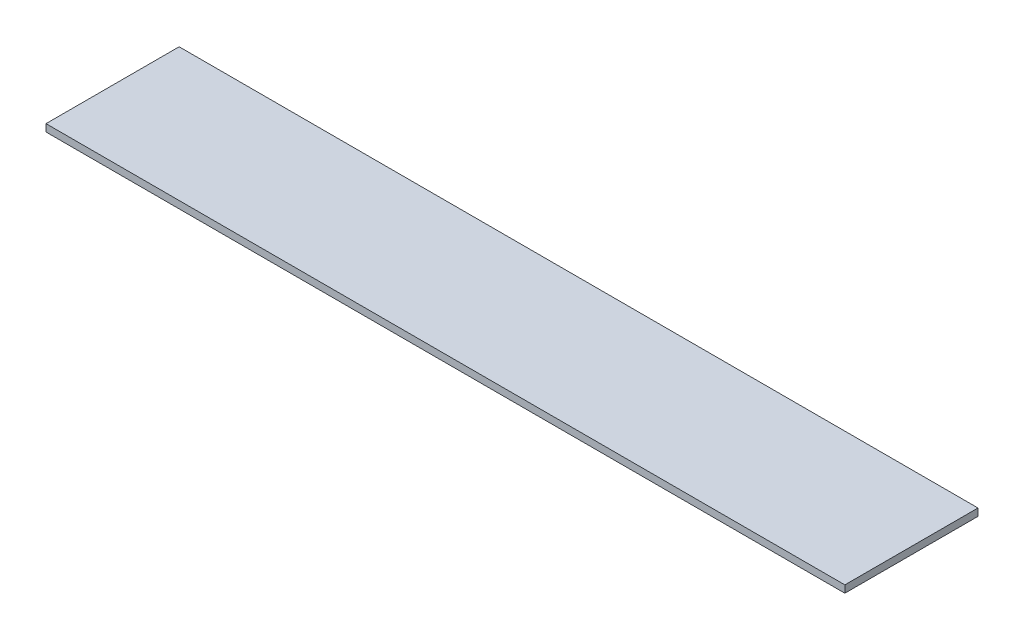
ISO-10303-21;
HEADER;
FILE_DESCRIPTION(('STEP AP214'),'2;1');
FILE_NAME('part.step','',(''),(''),'','','');
FILE_SCHEMA(('AUTOMOTIVE_DESIGN { 1 0 10303 214 1 1 1 1 }'));
ENDSEC;
DATA;
#1=APPLICATION_CONTEXT('core data for automotive mechanical design processes');
#2=APPLICATION_PROTOCOL_DEFINITION('international standard','automotive_design',2000,#1);
#3=PRODUCT_CONTEXT('',#1,'mechanical');
#4=PRODUCT('Part','Part','',(#3));
#5=PRODUCT_RELATED_PRODUCT_CATEGORY('part','',(#4));
#6=PRODUCT_DEFINITION_FORMATION('','',#4);
#7=PRODUCT_DEFINITION_CONTEXT('part definition',#1,'design');
#8=PRODUCT_DEFINITION('design','',#6,#7);
#9=PRODUCT_DEFINITION_SHAPE('','',#8);
#10=(LENGTH_UNIT() NAMED_UNIT(*) SI_UNIT(.MILLI.,.METRE.));
#11=(NAMED_UNIT(*) PLANE_ANGLE_UNIT() SI_UNIT($,.RADIAN.));
#12=(NAMED_UNIT(*) SI_UNIT($,.STERADIAN.) SOLID_ANGLE_UNIT());
#13=UNCERTAINTY_MEASURE_WITH_UNIT(LENGTH_MEASURE(1.E-05),#10,'distance_accuracy_value','');
#14=(GEOMETRIC_REPRESENTATION_CONTEXT(3) GLOBAL_UNCERTAINTY_ASSIGNED_CONTEXT((#13)) GLOBAL_UNIT_ASSIGNED_CONTEXT((#10,
#11,#12)) REPRESENTATION_CONTEXT('',''));
#15=CARTESIAN_POINT('',(0.,0.,0.));
#16=DIRECTION('',(0.,0.,1.));
#17=DIRECTION('',(1.,0.,0.));
#18=AXIS2_PLACEMENT_3D('',#15,#16,#17);
#19=CARTESIAN_POINT('',(0.,7.62,0.));
#20=DIRECTION('',(1.,0.,0.));
#21=DIRECTION('',(0.,0.,-1.));
#22=AXIS2_PLACEMENT_3D('',#19,#20,#21);
#23=PLANE('',#22);
#24=DIRECTION('',(0.,0.,1.));
#25=VECTOR('',#24,1.);
#26=CARTESIAN_POINT('',(0.,0.,0.));
#27=LINE('',#26,#25);
#28=CARTESIAN_POINT('',(0.,0.,-139.7));
#29=VERTEX_POINT('',#28);
#30=CARTESIAN_POINT('',(0.,0.,0.));
#31=VERTEX_POINT('',#30);
#32=EDGE_CURVE('E113',#29,#31,#27,.T.);
#33=ORIENTED_EDGE('',*,*,#32,.T.);
#34=DIRECTION('',(0.,-1.,0.));
#35=VECTOR('',#34,1.);
#36=CARTESIAN_POINT('',(0.,7.62,0.));
#37=LINE('',#36,#35);
#38=CARTESIAN_POINT('',(0.,7.62,0.));
#39=VERTEX_POINT('',#38);
#40=EDGE_CURVE('E11',#39,#31,#37,.T.);
#41=ORIENTED_EDGE('',*,*,#40,.F.);
#42=DIRECTION('',(0.,0.,1.));
#43=VECTOR('',#42,1.);
#44=CARTESIAN_POINT('',(0.,7.62,0.));
#45=LINE('',#44,#43);
#46=CARTESIAN_POINT('',(0.,7.62,-139.7));
#47=VERTEX_POINT('',#46);
#48=EDGE_CURVE('E97',#47,#39,#45,.T.);
#49=ORIENTED_EDGE('',*,*,#48,.F.);
#50=DIRECTION('',(0.,-1.,0.));
#51=VECTOR('',#50,1.);
#52=CARTESIAN_POINT('',(0.,7.62,-139.7));
#53=LINE('',#52,#51);
#54=EDGE_CURVE('E109',#47,#29,#53,.T.);
#55=ORIENTED_EDGE('',*,*,#54,.T.);
#56=EDGE_LOOP('',(#33,#41,#49,#55));
#57=FACE_BOUND('',#56,.T.);
#58=ADVANCED_FACE('F45',(#57),#23,.F.);
#59=CARTESIAN_POINT('',(0.,7.62,0.));
#60=DIRECTION('',(0.,0.,-1.));
#61=DIRECTION('',(-1.,0.,0.));
#62=AXIS2_PLACEMENT_3D('',#59,#60,#61);
#63=PLANE('',#62);
#64=DIRECTION('',(1.,0.,0.));
#65=VECTOR('',#64,1.);
#66=CARTESIAN_POINT('',(0.,0.,0.));
#67=LINE('',#66,#65);
#68=CARTESIAN_POINT('',(838.2,0.,0.));
#69=VERTEX_POINT('',#68);
#70=EDGE_CURVE('E102',#31,#69,#67,.T.);
#71=ORIENTED_EDGE('',*,*,#70,.T.);
#72=DIRECTION('',(0.,-1.,0.));
#73=VECTOR('',#72,1.);
#74=CARTESIAN_POINT('',(838.2,7.62,0.));
#75=LINE('',#74,#73);
#76=CARTESIAN_POINT('',(838.2,7.62,0.));
#77=VERTEX_POINT('',#76);
#78=EDGE_CURVE('E54',#77,#69,#75,.T.);
#79=ORIENTED_EDGE('',*,*,#78,.F.);
#80=DIRECTION('',(1.,0.,0.));
#81=VECTOR('',#80,1.);
#82=CARTESIAN_POINT('',(0.,7.62,0.));
#83=LINE('',#82,#81);
#84=EDGE_CURVE('E92',#39,#77,#83,.T.);
#85=ORIENTED_EDGE('',*,*,#84,.F.);
#86=ORIENTED_EDGE('',*,*,#40,.T.);
#87=EDGE_LOOP('',(#71,#79,#85,#86));
#88=FACE_BOUND('',#87,.T.);
#89=ADVANCED_FACE('F101',(#88),#63,.F.);
#90=CARTESIAN_POINT('',(838.2,7.62,0.));
#91=DIRECTION('',(-1.,0.,0.));
#92=DIRECTION('',(0.,0.,1.));
#93=AXIS2_PLACEMENT_3D('',#90,#91,#92);
#94=PLANE('',#93);
#95=DIRECTION('',(0.,0.,-1.));
#96=VECTOR('',#95,1.);
#97=CARTESIAN_POINT('',(838.2,0.,0.));
#98=LINE('',#97,#96);
#99=CARTESIAN_POINT('',(838.2,0.,-139.7));
#100=VERTEX_POINT('',#99);
#101=EDGE_CURVE('E79',#69,#100,#98,.T.);
#102=ORIENTED_EDGE('',*,*,#101,.T.);
#103=DIRECTION('',(0.,-1.,0.));
#104=VECTOR('',#103,1.);
#105=CARTESIAN_POINT('',(838.2,7.62,-139.7));
#106=LINE('',#105,#104);
#107=CARTESIAN_POINT('',(838.2,7.62,-139.7));
#108=VERTEX_POINT('',#107);
#109=EDGE_CURVE('E104',#108,#100,#106,.T.);
#110=ORIENTED_EDGE('',*,*,#109,.F.);
#111=DIRECTION('',(0.,0.,-1.));
#112=VECTOR('',#111,1.);
#113=CARTESIAN_POINT('',(838.2,7.62,0.));
#114=LINE('',#113,#112);
#115=EDGE_CURVE('E95',#77,#108,#114,.T.);
#116=ORIENTED_EDGE('',*,*,#115,.F.);
#117=ORIENTED_EDGE('',*,*,#78,.T.);
#118=EDGE_LOOP('',(#102,#110,#116,#117));
#119=FACE_BOUND('',#118,.T.);
#120=ADVANCED_FACE('F105',(#119),#94,.F.);
#121=CARTESIAN_POINT('',(0.,7.62,-139.7));
#122=DIRECTION('',(0.,0.,1.));
#123=DIRECTION('',(1.,0.,0.));
#124=AXIS2_PLACEMENT_3D('',#121,#122,#123);
#125=PLANE('',#124);
#126=DIRECTION('',(-1.,0.,0.));
#127=VECTOR('',#126,1.);
#128=CARTESIAN_POINT('',(0.,0.,-139.7));
#129=LINE('',#128,#127);
#130=EDGE_CURVE('E85',#100,#29,#129,.T.);
#131=ORIENTED_EDGE('',*,*,#130,.T.);
#132=ORIENTED_EDGE('',*,*,#54,.F.);
#133=DIRECTION('',(-1.,0.,0.));
#134=VECTOR('',#133,1.);
#135=CARTESIAN_POINT('',(0.,7.62,-139.7));
#136=LINE('',#135,#134);
#137=EDGE_CURVE('E62',#108,#47,#136,.T.);
#138=ORIENTED_EDGE('',*,*,#137,.F.);
#139=ORIENTED_EDGE('',*,*,#109,.T.);
#140=EDGE_LOOP('',(#131,#132,#138,#139));
#141=FACE_BOUND('',#140,.T.);
#142=ADVANCED_FACE('F126',(#141),#125,.F.);
#143=CARTESIAN_POINT('',(0.,7.62,0.));
#144=DIRECTION('',(0.,-1.,0.));
#145=DIRECTION('',(0.,0.,-1.));
#146=AXIS2_PLACEMENT_3D('',#143,#144,#145);
#147=PLANE('',#146);
#148=ORIENTED_EDGE('',*,*,#48,.T.);
#149=ORIENTED_EDGE('',*,*,#84,.T.);
#150=ORIENTED_EDGE('',*,*,#115,.T.);
#151=ORIENTED_EDGE('',*,*,#137,.T.);
#152=EDGE_LOOP('',(#148,#149,#150,#151));
#153=FACE_BOUND('',#152,.T.);
#154=ADVANCED_FACE('F93',(#153),#147,.F.);
#155=CARTESIAN_POINT('',(0.,0.,0.));
#156=DIRECTION('',(0.,-1.,0.));
#157=DIRECTION('',(0.,0.,-1.));
#158=AXIS2_PLACEMENT_3D('',#155,#156,#157);
#159=PLANE('',#158);
#160=ORIENTED_EDGE('',*,*,#32,.F.);
#161=ORIENTED_EDGE('',*,*,#130,.F.);
#162=ORIENTED_EDGE('',*,*,#101,.F.);
#163=ORIENTED_EDGE('',*,*,#70,.F.);
#164=EDGE_LOOP('',(#160,#161,#162,#163));
#165=FACE_BOUND('',#164,.T.);
#166=ADVANCED_FACE('F129',(#165),#159,.T.);
#167=CLOSED_SHELL('',(#58,#89,#120,#142,#154,#166));
#168=MANIFOLD_SOLID_BREP('B2',#167);
#169=ADVANCED_BREP_SHAPE_REPRESENTATION('',(#18,#168),#14);
#170=SHAPE_DEFINITION_REPRESENTATION(#9,#169);
ENDSEC;
END-ISO-10303-21;
